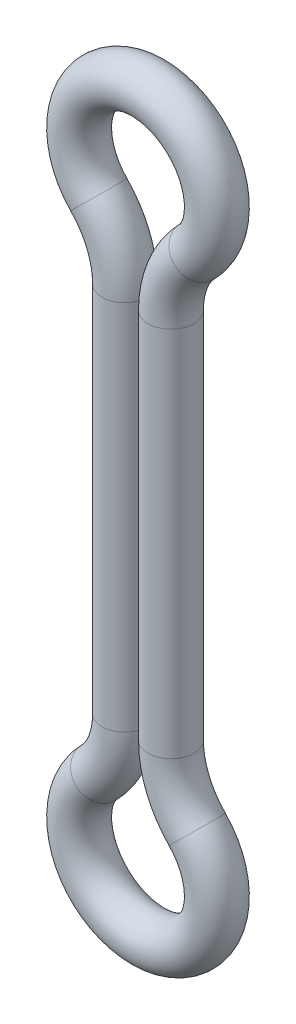
ISO-10303-21;
HEADER;
FILE_DESCRIPTION(('STEP AP214'),'2;1');
FILE_NAME('part.step','',(''),(''),'','','');
FILE_SCHEMA(('AUTOMOTIVE_DESIGN { 1 0 10303 214 1 1 1 1 }'));
ENDSEC;
DATA;
#1=APPLICATION_CONTEXT('core data for automotive mechanical design processes');
#2=APPLICATION_PROTOCOL_DEFINITION('international standard','automotive_design',2000,#1);
#3=PRODUCT_CONTEXT('',#1,'mechanical');
#4=PRODUCT('Part','Part','',(#3));
#5=PRODUCT_RELATED_PRODUCT_CATEGORY('part','',(#4));
#6=PRODUCT_DEFINITION_FORMATION('','',#4);
#7=PRODUCT_DEFINITION_CONTEXT('part definition',#1,'design');
#8=PRODUCT_DEFINITION('design','',#6,#7);
#9=PRODUCT_DEFINITION_SHAPE('','',#8);
#10=(LENGTH_UNIT() NAMED_UNIT(*) SI_UNIT(.MILLI.,.METRE.));
#11=(NAMED_UNIT(*) PLANE_ANGLE_UNIT() SI_UNIT($,.RADIAN.));
#12=(NAMED_UNIT(*) SI_UNIT($,.STERADIAN.) SOLID_ANGLE_UNIT());
#13=UNCERTAINTY_MEASURE_WITH_UNIT(LENGTH_MEASURE(1.E-05),#10,'distance_accuracy_value','');
#14=(GEOMETRIC_REPRESENTATION_CONTEXT(3) GLOBAL_UNCERTAINTY_ASSIGNED_CONTEXT((#13)) GLOBAL_UNIT_ASSIGNED_CONTEXT((#10,
#11,#12)) REPRESENTATION_CONTEXT('',''));
#15=CARTESIAN_POINT('',(0.,0.,0.));
#16=DIRECTION('',(0.,0.,1.));
#17=DIRECTION('',(1.,0.,0.));
#18=AXIS2_PLACEMENT_3D('',#15,#16,#17);
#19=CARTESIAN_POINT('',(-7.99999999999999,9.79795897113271,0.));
#20=DIRECTION('',(0.,0.,1.));
#21=DIRECTION('',(1.,0.,0.));
#22=AXIS2_PLACEMENT_3D('',#19,#20,#21);
#23=TOROIDAL_SURFACE('',#22,7.99999999999998,2.);
#24=CARTESIAN_POINT('',(-2.28571428571417,4.19912527334273,0.));
#25=DIRECTION('',(0.699854212223787,0.714285714285693,0.));
#26=DIRECTION('',(0.,0.,1.));
#27=AXIS2_PLACEMENT_3D('',#24,#25,#26);
#28=CIRCLE('',#27,2.);
#29=CARTESIAN_POINT('',(-0.857142857142712,2.79941684889523,0.));
#30=VERTEX_POINT('',#29);
#31=EDGE_CURVE('E37',#30,#30,#28,.T.);
#32=CARTESIAN_POINT('',(0.,9.79795897113288,0.));
#33=DIRECTION('',(0.,1.,0.));
#34=DIRECTION('',(0.,0.,1.));
#35=AXIS2_PLACEMENT_3D('',#32,#33,#34);
#36=CIRCLE('',#35,2.);
#37=CARTESIAN_POINT('',(1.99999999999999,9.79795897113292,0.));
#38=VERTEX_POINT('',#37);
#39=EDGE_CURVE('E10',#38,#38,#36,.T.);
#40=CARTESIAN_POINT('',(-7.99999999999999,9.79795897113271,0.));
#41=DIRECTION('',(0.,0.,1.));
#42=DIRECTION('',(1.,0.,0.));
#43=AXIS2_PLACEMENT_3D('',#40,#41,#42);
#44=CIRCLE('',#43,9.99999999999998);
#45=EDGE_CURVE('',#30,#38,#44,.T.);
#46=ORIENTED_EDGE('',*,*,#31,.T.);
#47=ORIENTED_EDGE('',*,*,#39,.F.);
#48=ORIENTED_EDGE('',*,*,#45,.T.);
#49=ORIENTED_EDGE('',*,*,#45,.F.);
#50=EDGE_LOOP('',(#46,#48,#47,#49));
#51=FACE_BOUND('',#50,.T.);
#52=ADVANCED_FACE('F31',(#51),#23,.T.);
#53=CARTESIAN_POINT('',(2.00000000000001,0.,0.));
#54=DIRECTION('',(0.,0.,-1.));
#55=DIRECTION('',(-1.,0.,0.));
#56=AXIS2_PLACEMENT_3D('',#53,#54,#55);
#57=TOROIDAL_SURFACE('',#56,6.00000000000002,2.);
#58=CARTESIAN_POINT('',(6.28571428571437,4.19912527334254,0.));
#59=DIRECTION('',(0.699854212223754,-0.714285714285726,0.));
#60=DIRECTION('',(0.,0.,1.));
#61=AXIS2_PLACEMENT_3D('',#58,#59,#60);
#62=CIRCLE('',#61,2.);
#63=CARTESIAN_POINT('',(4.85714285714295,2.799416848895,0.));
#64=VERTEX_POINT('',#63);
#65=EDGE_CURVE('E41',#64,#64,#62,.T.);
#66=ORIENTED_EDGE('',*,*,#65,.T.);
#67=EDGE_LOOP('',(#66));
#68=FACE_BOUND('',#67,.T.);
#69=ORIENTED_EDGE('',*,*,#31,.F.);
#70=EDGE_LOOP('',(#69));
#71=FACE_BOUND('',#70,.T.);
#72=ADVANCED_FACE('F75',(#68,#71),#57,.T.);
#73=CARTESIAN_POINT('',(12.,9.79795897113272,0.));
#74=DIRECTION('',(0.,0.,1.));
#75=DIRECTION('',(1.,0.,0.));
#76=AXIS2_PLACEMENT_3D('',#73,#74,#75);
#77=TOROIDAL_SURFACE('',#76,7.99999999999999,2.);
#78=CARTESIAN_POINT('',(4.00000000000002,9.79795897113263,0.));
#79=DIRECTION('',(0.,-1.,0.));
#80=DIRECTION('',(0.,0.,1.));
#81=AXIS2_PLACEMENT_3D('',#78,#79,#80);
#82=CIRCLE('',#81,2.);
#83=CARTESIAN_POINT('',(2.00000000000002,9.7979589711326,0.));
#84=VERTEX_POINT('',#83);
#85=EDGE_CURVE('E45',#84,#84,#82,.T.);
#86=CARTESIAN_POINT('',(12.,9.79795897113272,0.));
#87=DIRECTION('',(0.,0.,1.));
#88=DIRECTION('',(1.,0.,0.));
#89=AXIS2_PLACEMENT_3D('',#86,#87,#88);
#90=CIRCLE('',#89,9.99999999999999);
#91=EDGE_CURVE('',#84,#64,#90,.T.);
#92=ORIENTED_EDGE('',*,*,#85,.T.);
#93=ORIENTED_EDGE('',*,*,#65,.F.);
#94=ORIENTED_EDGE('',*,*,#91,.T.);
#95=ORIENTED_EDGE('',*,*,#91,.F.);
#96=EDGE_LOOP('',(#92,#94,#93,#95));
#97=FACE_BOUND('',#96,.T.);
#98=ADVANCED_FACE('F79',(#97),#77,.T.);
#99=CARTESIAN_POINT('',(4.00000000000002,42.2020410288672,0.));
#100=DIRECTION('',(0.,-1.,0.));
#101=DIRECTION('',(1.,0.,0.));
#102=AXIS2_PLACEMENT_3D('',#99,#100,#101);
#103=CYLINDRICAL_SURFACE('',#102,2.);
#104=CARTESIAN_POINT('',(4.00000000000002,42.2020410288672,0.));
#105=DIRECTION('',(0.,-1.,0.));
#106=DIRECTION('',(0.,0.,1.));
#107=AXIS2_PLACEMENT_3D('',#104,#105,#106);
#108=CIRCLE('',#107,2.);
#109=CARTESIAN_POINT('',(2.00000000000002,42.2020410288672,0.));
#110=VERTEX_POINT('',#109);
#111=EDGE_CURVE('E50',#110,#110,#108,.T.);
#112=ORIENTED_EDGE('',*,*,#111,.T.);
#113=EDGE_LOOP('',(#112));
#114=FACE_BOUND('',#113,.T.);
#115=ORIENTED_EDGE('',*,*,#85,.F.);
#116=EDGE_LOOP('',(#115));
#117=FACE_BOUND('',#116,.T.);
#118=ADVANCED_FACE('F85',(#114,#117),#103,.T.);
#119=CARTESIAN_POINT('',(12.,42.2020410288673,0.));
#120=DIRECTION('',(0.,0.,1.));
#121=DIRECTION('',(1.,0.,0.));
#122=AXIS2_PLACEMENT_3D('',#119,#120,#121);
#123=TOROIDAL_SURFACE('',#122,7.99999999999999,2.);
#124=CARTESIAN_POINT('',(6.28571428571423,47.8008747266573,0.));
#125=DIRECTION('',(-0.699854212223776,-0.714285714285704,0.));
#126=DIRECTION('',(0.,0.,1.));
#127=AXIS2_PLACEMENT_3D('',#124,#125,#126);
#128=CIRCLE('',#127,2.);
#129=CARTESIAN_POINT('',(4.85714285714279,49.2005831511049,0.));
#130=VERTEX_POINT('',#129);
#131=EDGE_CURVE('E53',#130,#130,#128,.T.);
#132=CARTESIAN_POINT('',(12.,42.2020410288673,0.));
#133=DIRECTION('',(0.,0.,1.));
#134=DIRECTION('',(1.,0.,0.));
#135=AXIS2_PLACEMENT_3D('',#132,#133,#134);
#136=CIRCLE('',#135,9.99999999999999);
#137=EDGE_CURVE('',#130,#110,#136,.T.);
#138=ORIENTED_EDGE('',*,*,#131,.T.);
#139=ORIENTED_EDGE('',*,*,#111,.F.);
#140=ORIENTED_EDGE('',*,*,#137,.T.);
#141=ORIENTED_EDGE('',*,*,#137,.F.);
#142=EDGE_LOOP('',(#138,#140,#139,#141));
#143=FACE_BOUND('',#142,.T.);
#144=ADVANCED_FACE('F92',(#143),#123,.T.);
#145=CARTESIAN_POINT('',(2.00000000000001,52.,0.));
#146=DIRECTION('',(0.,0.,-1.));
#147=DIRECTION('',(-1.,0.,0.));
#148=AXIS2_PLACEMENT_3D('',#145,#146,#147);
#149=TOROIDAL_SURFACE('',#148,6.00000000000001,2.);
#150=CARTESIAN_POINT('',(-2.28571428571429,47.8008747266574,0.));
#151=DIRECTION('',(-0.699854212223765,0.714285714285715,0.));
#152=DIRECTION('',(0.,0.,1.));
#153=AXIS2_PLACEMENT_3D('',#150,#151,#152);
#154=CIRCLE('',#153,2.);
#155=CARTESIAN_POINT('',(-0.857142857142858,49.2005831511049,0.));
#156=VERTEX_POINT('',#155);
#157=EDGE_CURVE('E56',#156,#156,#154,.T.);
#158=ORIENTED_EDGE('',*,*,#157,.T.);
#159=EDGE_LOOP('',(#158));
#160=FACE_BOUND('',#159,.T.);
#161=ORIENTED_EDGE('',*,*,#131,.F.);
#162=EDGE_LOOP('',(#161));
#163=FACE_BOUND('',#162,.T.);
#164=ADVANCED_FACE('F72',(#160,#163),#149,.T.);
#165=CARTESIAN_POINT('',(-8.,42.2020410288673,0.));
#166=DIRECTION('',(0.,0.,1.));
#167=DIRECTION('',(1.,0.,0.));
#168=AXIS2_PLACEMENT_3D('',#165,#166,#167);
#169=TOROIDAL_SURFACE('',#168,7.99999999999999,2.);
#170=CARTESIAN_POINT('',(0.,42.2020410288673,0.));
#171=DIRECTION('',(0.,1.,0.));
#172=DIRECTION('',(0.,0.,1.));
#173=AXIS2_PLACEMENT_3D('',#170,#171,#172);
#174=CIRCLE('',#173,2.);
#175=CARTESIAN_POINT('',(1.99999999999999,42.2020410288673,0.));
#176=VERTEX_POINT('',#175);
#177=EDGE_CURVE('E59',#176,#176,#174,.T.);
#178=CARTESIAN_POINT('',(-8.,42.2020410288673,0.));
#179=DIRECTION('',(0.,0.,1.));
#180=DIRECTION('',(1.,0.,0.));
#181=AXIS2_PLACEMENT_3D('',#178,#179,#180);
#182=CIRCLE('',#181,9.99999999999999);
#183=EDGE_CURVE('',#176,#156,#182,.T.);
#184=ORIENTED_EDGE('',*,*,#177,.T.);
#185=ORIENTED_EDGE('',*,*,#157,.F.);
#186=ORIENTED_EDGE('',*,*,#183,.T.);
#187=ORIENTED_EDGE('',*,*,#183,.F.);
#188=EDGE_LOOP('',(#184,#186,#185,#187));
#189=FACE_BOUND('',#188,.T.);
#190=ADVANCED_FACE('F63',(#189),#169,.T.);
#191=CARTESIAN_POINT('',(0.,42.2020410288673,0.));
#192=DIRECTION('',(0.,-1.,0.));
#193=DIRECTION('',(1.,0.,0.));
#194=AXIS2_PLACEMENT_3D('',#191,#192,#193);
#195=CYLINDRICAL_SURFACE('',#194,2.);
#196=ORIENTED_EDGE('',*,*,#177,.F.);
#197=EDGE_LOOP('',(#196));
#198=FACE_BOUND('',#197,.T.);
#199=ORIENTED_EDGE('',*,*,#39,.T.);
#200=EDGE_LOOP('',(#199));
#201=FACE_BOUND('',#200,.T.);
#202=ADVANCED_FACE('F66',(#198,#201),#195,.T.);
#203=CLOSED_SHELL('',(#52,#72,#98,#118,#144,#164,#190,#202));
#204=MANIFOLD_SOLID_BREP('B2',#203);
#205=ADVANCED_BREP_SHAPE_REPRESENTATION('',(#18,#204),#14);
#206=SHAPE_DEFINITION_REPRESENTATION(#9,#205);
ENDSEC;
END-ISO-10303-21;
